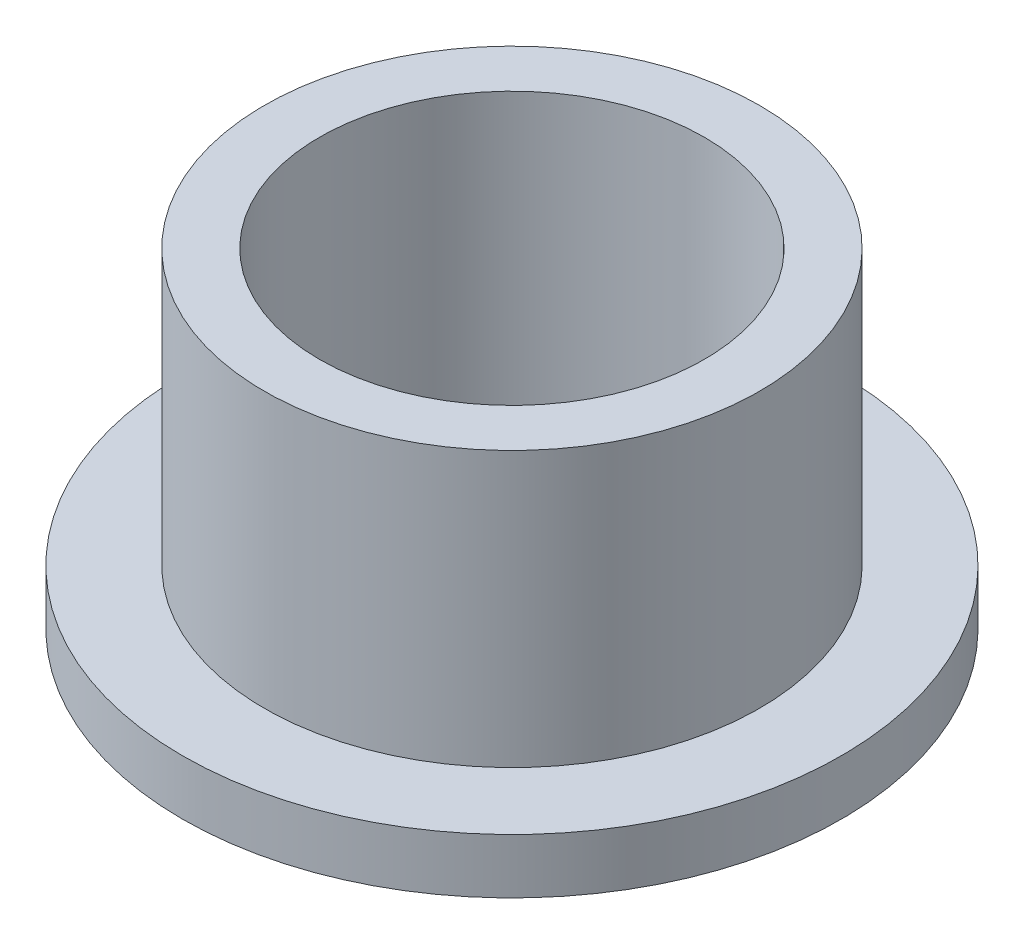
ISO-10303-21;
HEADER;
FILE_DESCRIPTION(('STEP AP214'),'2;1');
FILE_NAME('part.step','',(''),(''),'','','');
FILE_SCHEMA(('AUTOMOTIVE_DESIGN { 1 0 10303 214 1 1 1 1 }'));
ENDSEC;
DATA;
#1=APPLICATION_CONTEXT('core data for automotive mechanical design processes');
#2=APPLICATION_PROTOCOL_DEFINITION('international standard','automotive_design',2000,#1);
#3=PRODUCT_CONTEXT('',#1,'mechanical');
#4=PRODUCT('Part','Part','',(#3));
#5=PRODUCT_RELATED_PRODUCT_CATEGORY('part','',(#4));
#6=PRODUCT_DEFINITION_FORMATION('','',#4);
#7=PRODUCT_DEFINITION_CONTEXT('part definition',#1,'design');
#8=PRODUCT_DEFINITION('design','',#6,#7);
#9=PRODUCT_DEFINITION_SHAPE('','',#8);
#10=(LENGTH_UNIT() NAMED_UNIT(*) SI_UNIT(.MILLI.,.METRE.));
#11=(NAMED_UNIT(*) PLANE_ANGLE_UNIT() SI_UNIT($,.RADIAN.));
#12=(NAMED_UNIT(*) SI_UNIT($,.STERADIAN.) SOLID_ANGLE_UNIT());
#13=UNCERTAINTY_MEASURE_WITH_UNIT(LENGTH_MEASURE(1.E-05),#10,'distance_accuracy_value','');
#14=(GEOMETRIC_REPRESENTATION_CONTEXT(3) GLOBAL_UNCERTAINTY_ASSIGNED_CONTEXT((#13)) GLOBAL_UNIT_ASSIGNED_CONTEXT((#10,
#11,#12)) REPRESENTATION_CONTEXT('',''));
#15=CARTESIAN_POINT('',(0.,0.,0.));
#16=DIRECTION('',(0.,0.,1.));
#17=DIRECTION('',(1.,0.,0.));
#18=AXIS2_PLACEMENT_3D('',#15,#16,#17);
#19=CARTESIAN_POINT('',(0.,19.05,0.));
#20=DIRECTION('',(0.,1.,0.));
#21=DIRECTION('',(0.,0.,1.));
#22=AXIS2_PLACEMENT_3D('',#19,#20,#21);
#23=PLANE('',#22);
#24=CARTESIAN_POINT('',(0.,19.05,0.));
#25=DIRECTION('',(0.,1.,0.));
#26=DIRECTION('',(0.,0.,1.));
#27=AXIS2_PLACEMENT_3D('',#24,#25,#26);
#28=CIRCLE('',#27,14.3129);
#29=CARTESIAN_POINT('',(0.,19.05,-14.3129));
#30=VERTEX_POINT('',#29);
#31=EDGE_CURVE('E12',#30,#30,#28,.T.);
#32=ORIENTED_EDGE('',*,*,#31,.T.);
#33=EDGE_LOOP('',(#32));
#34=FACE_BOUND('',#33,.T.);
#35=CARTESIAN_POINT('',(0.,19.05,0.));
#36=DIRECTION('',(0.,1.,0.));
#37=DIRECTION('',(0.,0.,1.));
#38=AXIS2_PLACEMENT_3D('',#35,#36,#37);
#39=CIRCLE('',#38,11.1252);
#40=CARTESIAN_POINT('',(0.,19.05,-11.1252));
#41=VERTEX_POINT('',#40);
#42=EDGE_CURVE('E51',#41,#41,#39,.T.);
#43=ORIENTED_EDGE('',*,*,#42,.F.);
#44=EDGE_LOOP('',(#43));
#45=FACE_BOUND('',#44,.T.);
#46=ADVANCED_FACE('F44',(#34,#45),#23,.T.);
#47=CARTESIAN_POINT('',(0.,0.,0.));
#48=DIRECTION('',(0.,1.,0.));
#49=DIRECTION('',(0.,0.,1.));
#50=AXIS2_PLACEMENT_3D('',#47,#48,#49);
#51=PLANE('',#50);
#52=CARTESIAN_POINT('',(0.,0.,0.));
#53=DIRECTION('',(0.,1.,0.));
#54=DIRECTION('',(0.,0.,1.));
#55=AXIS2_PLACEMENT_3D('',#52,#53,#54);
#56=CIRCLE('',#55,11.1252);
#57=CARTESIAN_POINT('',(0.,0.,-11.1252));
#58=VERTEX_POINT('',#57);
#59=EDGE_CURVE('E55',#58,#58,#56,.T.);
#60=ORIENTED_EDGE('',*,*,#59,.T.);
#61=EDGE_LOOP('',(#60));
#62=FACE_BOUND('',#61,.T.);
#63=CARTESIAN_POINT('',(0.,0.,0.));
#64=DIRECTION('',(0.,1.,0.));
#65=DIRECTION('',(0.,0.,1.));
#66=AXIS2_PLACEMENT_3D('',#63,#64,#65);
#67=CIRCLE('',#66,19.05);
#68=CARTESIAN_POINT('',(0.,0.,19.05));
#69=VERTEX_POINT('',#68);
#70=EDGE_CURVE('E62',#69,#69,#67,.T.);
#71=ORIENTED_EDGE('',*,*,#70,.F.);
#72=EDGE_LOOP('',(#71));
#73=FACE_BOUND('',#72,.T.);
#74=ADVANCED_FACE('F87',(#62,#73),#51,.F.);
#75=CARTESIAN_POINT('',(0.,19.05,0.));
#76=DIRECTION('',(0.,-1.,0.));
#77=DIRECTION('',(0.,0.,-1.));
#78=AXIS2_PLACEMENT_3D('',#75,#76,#77);
#79=CYLINDRICAL_SURFACE('',#78,14.3129);
#80=CARTESIAN_POINT('',(0.,3.175,0.));
#81=DIRECTION('',(0.,1.,0.));
#82=DIRECTION('',(0.,0.,1.));
#83=AXIS2_PLACEMENT_3D('',#80,#81,#82);
#84=CIRCLE('',#83,14.3129);
#85=CARTESIAN_POINT('',(0.,3.175,-14.3129));
#86=VERTEX_POINT('',#85);
#87=EDGE_CURVE('E65',#86,#86,#84,.T.);
#88=CARTESIAN_POINT('',(0.,3.175,-14.3129));
#89=CARTESIAN_POINT('',(0.,3.34036458333333,-14.3129));
#90=CARTESIAN_POINT('',(0.,3.50572916666666,-14.3129));
#91=CARTESIAN_POINT('',(0.,3.83645833333333,-14.3129));
#92=CARTESIAN_POINT('',(0.,4.00182291666666,-14.3129));
#93=CARTESIAN_POINT('',(0.,4.33255208333333,-14.3129));
#94=CARTESIAN_POINT('',(0.,4.49791666666666,-14.3129));
#95=CARTESIAN_POINT('',(0.,4.82864583333333,-14.3129));
#96=CARTESIAN_POINT('',(0.,4.99401041666666,-14.3129));
#97=CARTESIAN_POINT('',(0.,5.32473958333333,-14.3129));
#98=CARTESIAN_POINT('',(0.,5.49010416666666,-14.3129));
#99=CARTESIAN_POINT('',(0.,5.82083333333333,-14.3129));
#100=CARTESIAN_POINT('',(0.,5.98619791666666,-14.3129));
#101=CARTESIAN_POINT('',(0.,6.31692708333333,-14.3129));
#102=CARTESIAN_POINT('',(0.,6.48229166666666,-14.3129));
#103=CARTESIAN_POINT('',(0.,6.81302083333333,-14.3129));
#104=CARTESIAN_POINT('',(0.,6.97838541666666,-14.3129));
#105=CARTESIAN_POINT('',(0.,7.30911458333333,-14.3129));
#106=CARTESIAN_POINT('',(0.,7.47447916666667,-14.3129));
#107=CARTESIAN_POINT('',(0.,7.80520833333333,-14.3129));
#108=CARTESIAN_POINT('',(0.,7.97057291666667,-14.3129));
#109=CARTESIAN_POINT('',(0.,8.30130208333333,-14.3129));
#110=CARTESIAN_POINT('',(0.,8.46666666666666,-14.3129));
#111=CARTESIAN_POINT('',(0.,8.79739583333333,-14.3129));
#112=CARTESIAN_POINT('',(0.,8.96276041666667,-14.3129));
#113=CARTESIAN_POINT('',(0.,9.29348958333333,-14.3129));
#114=CARTESIAN_POINT('',(0.,9.45885416666667,-14.3129));
#115=CARTESIAN_POINT('',(0.,9.78958333333333,-14.3129));
#116=CARTESIAN_POINT('',(0.,9.95494791666667,-14.3129));
#117=CARTESIAN_POINT('',(0.,10.2856770833333,-14.3129));
#118=CARTESIAN_POINT('',(0.,10.4510416666667,-14.3129));
#119=CARTESIAN_POINT('',(0.,10.7817708333333,-14.3129));
#120=CARTESIAN_POINT('',(0.,10.9471354166667,-14.3129));
#121=CARTESIAN_POINT('',(0.,11.2778645833333,-14.3129));
#122=CARTESIAN_POINT('',(0.,11.4432291666667,-14.3129));
#123=CARTESIAN_POINT('',(0.,11.7739583333333,-14.3129));
#124=CARTESIAN_POINT('',(0.,11.9393229166667,-14.3129));
#125=CARTESIAN_POINT('',(0.,12.2700520833333,-14.3129));
#126=CARTESIAN_POINT('',(0.,12.4354166666667,-14.3129));
#127=CARTESIAN_POINT('',(0.,12.7661458333333,-14.3129));
#128=CARTESIAN_POINT('',(0.,12.9315104166667,-14.3129));
#129=CARTESIAN_POINT('',(0.,13.2622395833333,-14.3129));
#130=CARTESIAN_POINT('',(0.,13.4276041666667,-14.3129));
#131=CARTESIAN_POINT('',(0.,13.7583333333333,-14.3129));
#132=CARTESIAN_POINT('',(0.,13.9236979166667,-14.3129));
#133=CARTESIAN_POINT('',(0.,14.2544270833333,-14.3129));
#134=CARTESIAN_POINT('',(0.,14.4197916666667,-14.3129));
#135=CARTESIAN_POINT('',(0.,14.7505208333333,-14.3129));
#136=CARTESIAN_POINT('',(0.,14.9158854166667,-14.3129));
#137=CARTESIAN_POINT('',(0.,15.2466145833333,-14.3129));
#138=CARTESIAN_POINT('',(0.,15.4119791666667,-14.3129));
#139=CARTESIAN_POINT('',(0.,15.7427083333333,-14.3129));
#140=CARTESIAN_POINT('',(0.,15.9080729166667,-14.3129));
#141=CARTESIAN_POINT('',(0.,16.2388020833333,-14.3129));
#142=CARTESIAN_POINT('',(0.,16.4041666666667,-14.3129));
#143=CARTESIAN_POINT('',(0.,16.7348958333333,-14.3129));
#144=CARTESIAN_POINT('',(0.,16.9002604166667,-14.3129));
#145=CARTESIAN_POINT('',(0.,17.2309895833333,-14.3129));
#146=CARTESIAN_POINT('',(0.,17.3963541666667,-14.3129));
#147=CARTESIAN_POINT('',(0.,17.7270833333333,-14.3129));
#148=CARTESIAN_POINT('',(0.,17.8924479166667,-14.3129));
#149=CARTESIAN_POINT('',(0.,18.2231770833333,-14.3129));
#150=CARTESIAN_POINT('',(0.,18.3885416666667,-14.3129));
#151=CARTESIAN_POINT('',(0.,18.7192708333333,-14.3129));
#152=CARTESIAN_POINT('',(0.,18.8846354166667,-14.3129));
#153=CARTESIAN_POINT('',(0.,19.05,-14.3129));
#154=B_SPLINE_CURVE_WITH_KNOTS('',3,(#88,#89,#90,#91,#92,#93,#94,#95,#96,#97,#98,#99,#100,#101,
#102,#103,#104,#105,#106,#107,#108,#109,#110,#111,#112,#113,#114,#115,#116,#117,#118,#119,#120,
#121,#122,#123,#124,#125,#126,#127,#128,#129,#130,#131,#132,#133,#134,#135,#136,#137,#138,#139,
#140,#141,#142,#143,#144,#145,#146,#147,#148,#149,#150,#151,#152,#153),.UNSPECIFIED.,.F.,.F.,(4,
2,2,2,2,2,2,2,2,2,2,2,2,2,2,2,2,2,2,2,2,2,2,2,2,2,2,2,2,2,2,2,4),(0.,0.496093749999999,
0.992187499999998,1.48828125,1.984375,2.48046875,2.9765625,3.47265625,3.96875,4.46484375,
4.9609375,5.45703125,5.953125,6.44921875,6.9453125,7.44140625,7.9375,8.43359375,8.9296875,
9.42578125,9.921875,10.41796875,10.9140625,11.41015625,11.90625,12.40234375,12.8984375,
13.39453125,13.890625,14.38671875,14.8828125,15.37890625,15.875),.UNSPECIFIED.);
#155=EDGE_CURVE('BSEAM46',#86,#30,#154,.T.);
#156=ORIENTED_EDGE('',*,*,#87,.T.);
#157=ORIENTED_EDGE('',*,*,#31,.F.);
#158=ORIENTED_EDGE('',*,*,#155,.T.);
#159=ORIENTED_EDGE('',*,*,#155,.F.);
#160=EDGE_LOOP('',(#156,#158,#157,#159));
#161=FACE_BOUND('',#160,.T.);
#162=ADVANCED_FACE('F46',(#161),#79,.T.);
#163=CARTESIAN_POINT('',(0.,19.05,0.));
#164=DIRECTION('',(0.,-1.,0.));
#165=DIRECTION('',(0.,0.,-1.));
#166=AXIS2_PLACEMENT_3D('',#163,#164,#165);
#167=CYLINDRICAL_SURFACE('',#166,11.1252);
#168=CARTESIAN_POINT('',(0.,19.05,-11.1252));
#169=CARTESIAN_POINT('',(0.,18.8515625,-11.1252));
#170=CARTESIAN_POINT('',(0.,18.653125,-11.1252));
#171=CARTESIAN_POINT('',(0.,18.25625,-11.1252));
#172=CARTESIAN_POINT('',(0.,18.0578125,-11.1252));
#173=CARTESIAN_POINT('',(0.,17.6609375,-11.1252));
#174=CARTESIAN_POINT('',(0.,17.4625,-11.1252));
#175=CARTESIAN_POINT('',(0.,17.065625,-11.1252));
#176=CARTESIAN_POINT('',(0.,16.8671875,-11.1252));
#177=CARTESIAN_POINT('',(0.,16.4703125,-11.1252));
#178=CARTESIAN_POINT('',(0.,16.271875,-11.1252));
#179=CARTESIAN_POINT('',(0.,15.875,-11.1252));
#180=CARTESIAN_POINT('',(0.,15.6765625,-11.1252));
#181=CARTESIAN_POINT('',(0.,15.2796875,-11.1252));
#182=CARTESIAN_POINT('',(0.,15.08125,-11.1252));
#183=CARTESIAN_POINT('',(0.,14.684375,-11.1252));
#184=CARTESIAN_POINT('',(0.,14.4859375,-11.1252));
#185=CARTESIAN_POINT('',(0.,14.0890625,-11.1252));
#186=CARTESIAN_POINT('',(0.,13.890625,-11.1252));
#187=CARTESIAN_POINT('',(0.,13.49375,-11.1252));
#188=CARTESIAN_POINT('',(0.,13.2953125,-11.1252));
#189=CARTESIAN_POINT('',(0.,12.8984375,-11.1252));
#190=CARTESIAN_POINT('',(0.,12.7,-11.1252));
#191=CARTESIAN_POINT('',(0.,12.303125,-11.1252));
#192=CARTESIAN_POINT('',(0.,12.1046875,-11.1252));
#193=CARTESIAN_POINT('',(0.,11.7078125,-11.1252));
#194=CARTESIAN_POINT('',(0.,11.509375,-11.1252));
#195=CARTESIAN_POINT('',(0.,11.1125,-11.1252));
#196=CARTESIAN_POINT('',(0.,10.9140625,-11.1252));
#197=CARTESIAN_POINT('',(0.,10.5171875,-11.1252));
#198=CARTESIAN_POINT('',(0.,10.31875,-11.1252));
#199=CARTESIAN_POINT('',(0.,9.921875,-11.1252));
#200=CARTESIAN_POINT('',(0.,9.7234375,-11.1252));
#201=CARTESIAN_POINT('',(0.,9.3265625,-11.1252));
#202=CARTESIAN_POINT('',(0.,9.128125,-11.1252));
#203=CARTESIAN_POINT('',(0.,8.73125,-11.1252));
#204=CARTESIAN_POINT('',(0.,8.5328125,-11.1252));
#205=CARTESIAN_POINT('',(0.,8.1359375,-11.1252));
#206=CARTESIAN_POINT('',(0.,7.9375,-11.1252));
#207=CARTESIAN_POINT('',(0.,7.540625,-11.1252));
#208=CARTESIAN_POINT('',(0.,7.3421875,-11.1252));
#209=CARTESIAN_POINT('',(0.,6.9453125,-11.1252));
#210=CARTESIAN_POINT('',(0.,6.746875,-11.1252));
#211=CARTESIAN_POINT('',(0.,6.35,-11.1252));
#212=CARTESIAN_POINT('',(0.,6.1515625,-11.1252));
#213=CARTESIAN_POINT('',(0.,5.7546875,-11.1252));
#214=CARTESIAN_POINT('',(0.,5.55625,-11.1252));
#215=CARTESIAN_POINT('',(0.,5.159375,-11.1252));
#216=CARTESIAN_POINT('',(0.,4.9609375,-11.1252));
#217=CARTESIAN_POINT('',(0.,4.5640625,-11.1252));
#218=CARTESIAN_POINT('',(0.,4.365625,-11.1252));
#219=CARTESIAN_POINT('',(0.,3.96875,-11.1252));
#220=CARTESIAN_POINT('',(0.,3.7703125,-11.1252));
#221=CARTESIAN_POINT('',(0.,3.3734375,-11.1252));
#222=CARTESIAN_POINT('',(0.,3.175,-11.1252));
#223=CARTESIAN_POINT('',(0.,2.778125,-11.1252));
#224=CARTESIAN_POINT('',(0.,2.5796875,-11.1252));
#225=CARTESIAN_POINT('',(0.,2.1828125,-11.1252));
#226=CARTESIAN_POINT('',(0.,1.984375,-11.1252));
#227=CARTESIAN_POINT('',(0.,1.5875,-11.1252));
#228=CARTESIAN_POINT('',(0.,1.3890625,-11.1252));
#229=CARTESIAN_POINT('',(0.,0.992187500000001,-11.1252));
#230=CARTESIAN_POINT('',(0.,0.793750000000001,-11.1252));
#231=CARTESIAN_POINT('',(0.,0.396875,-11.1252));
#232=CARTESIAN_POINT('',(0.,0.1984375,-11.1252));
#233=CARTESIAN_POINT('',(0.,0.,-11.1252));
#234=B_SPLINE_CURVE_WITH_KNOTS('',3,(#168,#169,#170,#171,#172,#173,#174,#175,#176,#177,#178,
#179,#180,#181,#182,#183,#184,#185,#186,#187,#188,#189,#190,#191,#192,#193,#194,#195,#196,#197,
#198,#199,#200,#201,#202,#203,#204,#205,#206,#207,#208,#209,#210,#211,#212,#213,#214,#215,#216,
#217,#218,#219,#220,#221,#222,#223,#224,#225,#226,#227,#228,#229,#230,#231,#232,#233),
.UNSPECIFIED.,.F.,.F.,(4,2,2,2,2,2,2,2,2,2,2,2,2,2,2,2,2,2,2,2,2,2,2,2,2,2,2,2,2,2,2,2,4),(0.,
0.595312499999997,1.190625,1.7859375,2.38125,2.9765625,3.571875,4.1671875,4.7625,5.3578125,
5.953125,6.5484375,7.14375,7.7390625,8.334375,8.9296875,9.525,10.1203125,10.715625,11.3109375,
11.90625,12.5015625,13.096875,13.6921875,14.2875,14.8828125,15.478125,16.0734375,16.66875,
17.2640625,17.859375,18.4546875,19.05),.UNSPECIFIED.);
#235=EDGE_CURVE('BSEAM76',#41,#58,#234,.T.);
#236=ORIENTED_EDGE('',*,*,#42,.T.);
#237=ORIENTED_EDGE('',*,*,#59,.F.);
#238=ORIENTED_EDGE('',*,*,#235,.T.);
#239=ORIENTED_EDGE('',*,*,#235,.F.);
#240=EDGE_LOOP('',(#236,#238,#237,#239));
#241=FACE_BOUND('',#240,.T.);
#242=ADVANCED_FACE('F76',(#241),#167,.F.);
#243=CARTESIAN_POINT('',(0.,3.175,0.));
#244=DIRECTION('',(0.,1.,0.));
#245=DIRECTION('',(0.,0.,1.));
#246=AXIS2_PLACEMENT_3D('',#243,#244,#245);
#247=PLANE('',#246);
#248=CARTESIAN_POINT('',(0.,3.175,0.));
#249=DIRECTION('',(0.,1.,0.));
#250=DIRECTION('',(0.,0.,1.));
#251=AXIS2_PLACEMENT_3D('',#248,#249,#250);
#252=CIRCLE('',#251,19.05);
#253=CARTESIAN_POINT('',(0.,3.175,19.05));
#254=VERTEX_POINT('',#253);
#255=EDGE_CURVE('E60',#254,#254,#252,.T.);
#256=ORIENTED_EDGE('',*,*,#255,.T.);
#257=EDGE_LOOP('',(#256));
#258=FACE_BOUND('',#257,.T.);
#259=ORIENTED_EDGE('',*,*,#87,.F.);
#260=EDGE_LOOP('',(#259));
#261=FACE_BOUND('',#260,.T.);
#262=ADVANCED_FACE('F73',(#258,#261),#247,.T.);
#263=CARTESIAN_POINT('',(0.,3.175,0.));
#264=DIRECTION('',(0.,-1.,0.));
#265=DIRECTION('',(0.,0.,-1.));
#266=AXIS2_PLACEMENT_3D('',#263,#264,#265);
#267=CYLINDRICAL_SURFACE('',#266,19.05);
#268=ORIENTED_EDGE('',*,*,#255,.F.);
#269=EDGE_LOOP('',(#268));
#270=FACE_BOUND('',#269,.T.);
#271=ORIENTED_EDGE('',*,*,#70,.T.);
#272=EDGE_LOOP('',(#271));
#273=FACE_BOUND('',#272,.T.);
#274=ADVANCED_FACE('F75',(#270,#273),#267,.T.);
#275=CLOSED_SHELL('',(#46,#74,#162,#242,#262,#274));
#276=MANIFOLD_SOLID_BREP('B2',#275);
#277=ADVANCED_BREP_SHAPE_REPRESENTATION('',(#18,#276),#14);
#278=SHAPE_DEFINITION_REPRESENTATION(#9,#277);
ENDSEC;
END-ISO-10303-21;
